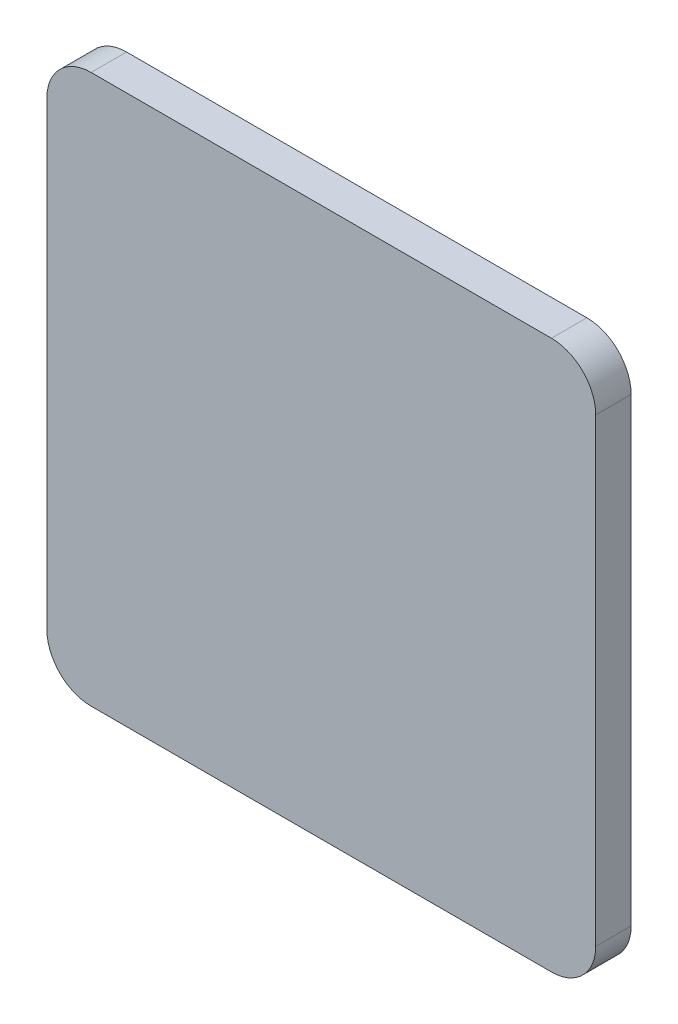
ISO-10303-21;
HEADER;
FILE_DESCRIPTION(('STEP AP214'),'2;1');
FILE_NAME('part.step','',(''),(''),'','','');
FILE_SCHEMA(('AUTOMOTIVE_DESIGN { 1 0 10303 214 1 1 1 1 }'));
ENDSEC;
DATA;
#1=APPLICATION_CONTEXT('core data for automotive mechanical design processes');
#2=APPLICATION_PROTOCOL_DEFINITION('international standard','automotive_design',2000,#1);
#3=PRODUCT_CONTEXT('',#1,'mechanical');
#4=PRODUCT('Part','Part','',(#3));
#5=PRODUCT_RELATED_PRODUCT_CATEGORY('part','',(#4));
#6=PRODUCT_DEFINITION_FORMATION('','',#4);
#7=PRODUCT_DEFINITION_CONTEXT('part definition',#1,'design');
#8=PRODUCT_DEFINITION('design','',#6,#7);
#9=PRODUCT_DEFINITION_SHAPE('','',#8);
#10=(LENGTH_UNIT() NAMED_UNIT(*) SI_UNIT(.MILLI.,.METRE.));
#11=(NAMED_UNIT(*) PLANE_ANGLE_UNIT() SI_UNIT($,.RADIAN.));
#12=(NAMED_UNIT(*) SI_UNIT($,.STERADIAN.) SOLID_ANGLE_UNIT());
#13=UNCERTAINTY_MEASURE_WITH_UNIT(LENGTH_MEASURE(1.E-05),#10,'distance_accuracy_value','');
#14=(GEOMETRIC_REPRESENTATION_CONTEXT(3) GLOBAL_UNCERTAINTY_ASSIGNED_CONTEXT((#13)) GLOBAL_UNIT_ASSIGNED_CONTEXT((#10,
#11,#12)) REPRESENTATION_CONTEXT('',''));
#15=CARTESIAN_POINT('',(0.,0.,0.));
#16=DIRECTION('',(0.,0.,1.));
#17=DIRECTION('',(1.,0.,0.));
#18=AXIS2_PLACEMENT_3D('',#15,#16,#17);
#19=CARTESIAN_POINT('',(-63.208571836183,-32.7973667305141,2.));
#20=DIRECTION('',(0.,0.,-1.));
#21=DIRECTION('',(-1.,0.,0.));
#22=AXIS2_PLACEMENT_3D('',#19,#20,#21);
#23=CYLINDRICAL_SURFACE('',#22,2.5);
#24=CARTESIAN_POINT('',(-63.208571836183,-32.7973667305141,0.));
#25=DIRECTION('',(0.,0.,1.));
#26=DIRECTION('',(1.,0.,0.));
#27=AXIS2_PLACEMENT_3D('',#24,#25,#26);
#28=CIRCLE('',#27,2.5);
#29=CARTESIAN_POINT('',(-65.708571836183,-32.7973667305141,0.));
#30=VERTEX_POINT('',#29);
#31=CARTESIAN_POINT('',(-63.208571836183,-35.2973667305141,0.));
#32=VERTEX_POINT('',#31);
#33=EDGE_CURVE('E129',#30,#32,#28,.T.);
#34=ORIENTED_EDGE('',*,*,#33,.T.);
#35=DIRECTION('',(0.,0.,-1.));
#36=VECTOR('',#35,1.);
#37=CARTESIAN_POINT('',(-63.208571836183,-35.2973667305141,2.));
#38=LINE('',#37,#36);
#39=CARTESIAN_POINT('',(-63.208571836183,-35.2973667305141,2.));
#40=VERTEX_POINT('',#39);
#41=EDGE_CURVE('E11',#40,#32,#38,.T.);
#42=ORIENTED_EDGE('',*,*,#41,.F.);
#43=CARTESIAN_POINT('',(-63.208571836183,-32.7973667305141,2.));
#44=DIRECTION('',(0.,0.,1.));
#45=DIRECTION('',(1.,0.,0.));
#46=AXIS2_PLACEMENT_3D('',#43,#44,#45);
#47=CIRCLE('',#46,2.5);
#48=CARTESIAN_POINT('',(-65.708571836183,-32.7973667305141,2.));
#49=VERTEX_POINT('',#48);
#50=EDGE_CURVE('E143',#49,#40,#47,.T.);
#51=ORIENTED_EDGE('',*,*,#50,.F.);
#52=DIRECTION('',(0.,0.,-1.));
#53=VECTOR('',#52,1.);
#54=CARTESIAN_POINT('',(-65.708571836183,-32.7973667305141,2.));
#55=LINE('',#54,#53);
#56=EDGE_CURVE('E125',#49,#30,#55,.T.);
#57=ORIENTED_EDGE('',*,*,#56,.T.);
#58=EDGE_LOOP('',(#34,#42,#51,#57));
#59=FACE_BOUND('',#58,.T.);
#60=ADVANCED_FACE('F33',(#59),#23,.T.);
#61=CARTESIAN_POINT('',(-37.208571836183,-35.2973667305141,2.));
#62=DIRECTION('',(0.,1.,0.));
#63=DIRECTION('',(0.,0.,1.));
#64=AXIS2_PLACEMENT_3D('',#61,#62,#63);
#65=PLANE('',#64);
#66=DIRECTION('',(1.,0.,0.));
#67=VECTOR('',#66,1.);
#68=CARTESIAN_POINT('',(-37.208571836183,-35.2973667305141,0.));
#69=LINE('',#68,#67);
#70=CARTESIAN_POINT('',(-37.208571836183,-35.2973667305141,0.));
#71=VERTEX_POINT('',#70);
#72=EDGE_CURVE('E132',#32,#71,#69,.T.);
#73=ORIENTED_EDGE('',*,*,#72,.T.);
#74=DIRECTION('',(0.,0.,-1.));
#75=VECTOR('',#74,1.);
#76=CARTESIAN_POINT('',(-37.208571836183,-35.2973667305141,2.));
#77=LINE('',#76,#75);
#78=CARTESIAN_POINT('',(-37.208571836183,-35.2973667305141,2.));
#79=VERTEX_POINT('',#78);
#80=EDGE_CURVE('E41',#79,#71,#77,.T.);
#81=ORIENTED_EDGE('',*,*,#80,.F.);
#82=DIRECTION('',(1.,0.,0.));
#83=VECTOR('',#82,1.);
#84=CARTESIAN_POINT('',(-37.208571836183,-35.2973667305141,2.));
#85=LINE('',#84,#83);
#86=EDGE_CURVE('E92',#40,#79,#85,.T.);
#87=ORIENTED_EDGE('',*,*,#86,.F.);
#88=ORIENTED_EDGE('',*,*,#41,.T.);
#89=EDGE_LOOP('',(#73,#81,#87,#88));
#90=FACE_BOUND('',#89,.T.);
#91=ADVANCED_FACE('F178',(#90),#65,.F.);
#92=CARTESIAN_POINT('',(-37.208571836183,-32.7973667305141,2.));
#93=DIRECTION('',(0.,0.,-1.));
#94=DIRECTION('',(-1.,0.,0.));
#95=AXIS2_PLACEMENT_3D('',#92,#93,#94);
#96=CYLINDRICAL_SURFACE('',#95,2.5);
#97=CARTESIAN_POINT('',(-37.208571836183,-32.7973667305141,0.));
#98=DIRECTION('',(0.,0.,1.));
#99=DIRECTION('',(1.,0.,0.));
#100=AXIS2_PLACEMENT_3D('',#97,#98,#99);
#101=CIRCLE('',#100,2.5);
#102=CARTESIAN_POINT('',(-34.7085718361831,-32.7973667305141,0.));
#103=VERTEX_POINT('',#102);
#104=EDGE_CURVE('E134',#71,#103,#101,.T.);
#105=ORIENTED_EDGE('',*,*,#104,.T.);
#106=DIRECTION('',(0.,0.,-1.));
#107=VECTOR('',#106,1.);
#108=CARTESIAN_POINT('',(-34.7085718361831,-32.7973667305141,2.));
#109=LINE('',#108,#107);
#110=CARTESIAN_POINT('',(-34.7085718361831,-32.7973667305141,2.));
#111=VERTEX_POINT('',#110);
#112=EDGE_CURVE('E150',#111,#103,#109,.T.);
#113=ORIENTED_EDGE('',*,*,#112,.F.);
#114=CARTESIAN_POINT('',(-37.208571836183,-32.7973667305141,2.));
#115=DIRECTION('',(0.,0.,1.));
#116=DIRECTION('',(1.,0.,0.));
#117=AXIS2_PLACEMENT_3D('',#114,#115,#116);
#118=CIRCLE('',#117,2.5);
#119=EDGE_CURVE('E158',#79,#111,#118,.T.);
#120=ORIENTED_EDGE('',*,*,#119,.F.);
#121=ORIENTED_EDGE('',*,*,#80,.T.);
#122=EDGE_LOOP('',(#105,#113,#120,#121));
#123=FACE_BOUND('',#122,.T.);
#124=ADVANCED_FACE('F156',(#123),#96,.T.);
#125=CARTESIAN_POINT('',(-34.708571836183,-6.79736673051408,2.));
#126=DIRECTION('',(-1.,0.,0.));
#127=DIRECTION('',(0.,-1.,0.));
#128=AXIS2_PLACEMENT_3D('',#125,#126,#127);
#129=PLANE('',#128);
#130=DIRECTION('',(0.,1.,0.));
#131=VECTOR('',#130,1.);
#132=CARTESIAN_POINT('',(-34.708571836183,-6.79736673051408,0.));
#133=LINE('',#132,#131);
#134=CARTESIAN_POINT('',(-34.708571836183,-6.79736673051408,0.));
#135=VERTEX_POINT('',#134);
#136=EDGE_CURVE('E136',#103,#135,#133,.T.);
#137=ORIENTED_EDGE('',*,*,#136,.T.);
#138=DIRECTION('',(0.,0.,-1.));
#139=VECTOR('',#138,1.);
#140=CARTESIAN_POINT('',(-34.708571836183,-6.79736673051408,2.));
#141=LINE('',#140,#139);
#142=CARTESIAN_POINT('',(-34.708571836183,-6.79736673051408,2.));
#143=VERTEX_POINT('',#142);
#144=EDGE_CURVE('E147',#143,#135,#141,.T.);
#145=ORIENTED_EDGE('',*,*,#144,.F.);
#146=DIRECTION('',(0.,1.,0.));
#147=VECTOR('',#146,1.);
#148=CARTESIAN_POINT('',(-34.708571836183,-6.79736673051408,2.));
#149=LINE('',#148,#147);
#150=EDGE_CURVE('E170',#111,#143,#149,.T.);
#151=ORIENTED_EDGE('',*,*,#150,.F.);
#152=ORIENTED_EDGE('',*,*,#112,.T.);
#153=EDGE_LOOP('',(#137,#145,#151,#152));
#154=FACE_BOUND('',#153,.T.);
#155=ADVANCED_FACE('F166',(#154),#129,.F.);
#156=CARTESIAN_POINT('',(-37.208571836183,-6.79736673051408,2.));
#157=DIRECTION('',(0.,0.,-1.));
#158=DIRECTION('',(-1.,0.,0.));
#159=AXIS2_PLACEMENT_3D('',#156,#157,#158);
#160=CYLINDRICAL_SURFACE('',#159,2.5);
#161=CARTESIAN_POINT('',(-37.208571836183,-6.79736673051408,0.));
#162=DIRECTION('',(0.,0.,1.));
#163=DIRECTION('',(1.,0.,0.));
#164=AXIS2_PLACEMENT_3D('',#161,#162,#163);
#165=CIRCLE('',#164,2.5);
#166=CARTESIAN_POINT('',(-37.208571836183,-4.29736673051408,0.));
#167=VERTEX_POINT('',#166);
#168=EDGE_CURVE('E138',#135,#167,#165,.T.);
#169=ORIENTED_EDGE('',*,*,#168,.T.);
#170=DIRECTION('',(0.,0.,-1.));
#171=VECTOR('',#170,1.);
#172=CARTESIAN_POINT('',(-37.208571836183,-4.29736673051408,2.));
#173=LINE('',#172,#171);
#174=CARTESIAN_POINT('',(-37.208571836183,-4.29736673051408,2.));
#175=VERTEX_POINT('',#174);
#176=EDGE_CURVE('E120',#175,#167,#173,.T.);
#177=ORIENTED_EDGE('',*,*,#176,.F.);
#178=CARTESIAN_POINT('',(-37.208571836183,-6.79736673051408,2.));
#179=DIRECTION('',(0.,0.,1.));
#180=DIRECTION('',(1.,0.,0.));
#181=AXIS2_PLACEMENT_3D('',#178,#179,#180);
#182=CIRCLE('',#181,2.5);
#183=EDGE_CURVE('E111',#143,#175,#182,.T.);
#184=ORIENTED_EDGE('',*,*,#183,.F.);
#185=ORIENTED_EDGE('',*,*,#144,.T.);
#186=EDGE_LOOP('',(#169,#177,#184,#185));
#187=FACE_BOUND('',#186,.T.);
#188=ADVANCED_FACE('F169',(#187),#160,.T.);
#189=CARTESIAN_POINT('',(-63.208571836183,-4.29736673051408,2.));
#190=DIRECTION('',(0.,-1.,0.));
#191=DIRECTION('',(0.,0.,-1.));
#192=AXIS2_PLACEMENT_3D('',#189,#190,#191);
#193=PLANE('',#192);
#194=DIRECTION('',(-1.,0.,0.));
#195=VECTOR('',#194,1.);
#196=CARTESIAN_POINT('',(-63.208571836183,-4.29736673051408,0.));
#197=LINE('',#196,#195);
#198=CARTESIAN_POINT('',(-63.208571836183,-4.29736673051408,0.));
#199=VERTEX_POINT('',#198);
#200=EDGE_CURVE('E119',#167,#199,#197,.T.);
#201=ORIENTED_EDGE('',*,*,#200,.T.);
#202=DIRECTION('',(0.,0.,-1.));
#203=VECTOR('',#202,1.);
#204=CARTESIAN_POINT('',(-63.208571836183,-4.29736673051408,2.));
#205=LINE('',#204,#203);
#206=CARTESIAN_POINT('',(-63.208571836183,-4.29736673051408,2.));
#207=VERTEX_POINT('',#206);
#208=EDGE_CURVE('E116',#207,#199,#205,.T.);
#209=ORIENTED_EDGE('',*,*,#208,.F.);
#210=DIRECTION('',(-1.,0.,0.));
#211=VECTOR('',#210,1.);
#212=CARTESIAN_POINT('',(-63.208571836183,-4.29736673051408,2.));
#213=LINE('',#212,#211);
#214=EDGE_CURVE('E105',#175,#207,#213,.T.);
#215=ORIENTED_EDGE('',*,*,#214,.F.);
#216=ORIENTED_EDGE('',*,*,#176,.T.);
#217=EDGE_LOOP('',(#201,#209,#215,#216));
#218=FACE_BOUND('',#217,.T.);
#219=ADVANCED_FACE('F117',(#218),#193,.F.);
#220=CARTESIAN_POINT('',(-63.208571836183,-6.79736673051408,2.));
#221=DIRECTION('',(0.,0.,-1.));
#222=DIRECTION('',(-1.,0.,0.));
#223=AXIS2_PLACEMENT_3D('',#220,#221,#222);
#224=CYLINDRICAL_SURFACE('',#223,2.5);
#225=CARTESIAN_POINT('',(-63.208571836183,-6.79736673051408,0.));
#226=DIRECTION('',(0.,0.,1.));
#227=DIRECTION('',(1.,0.,0.));
#228=AXIS2_PLACEMENT_3D('',#225,#226,#227);
#229=CIRCLE('',#228,2.5);
#230=CARTESIAN_POINT('',(-65.708571836183,-6.79736673051408,0.));
#231=VERTEX_POINT('',#230);
#232=EDGE_CURVE('E78',#199,#231,#229,.T.);
#233=ORIENTED_EDGE('',*,*,#232,.T.);
#234=DIRECTION('',(0.,0.,-1.));
#235=VECTOR('',#234,1.);
#236=CARTESIAN_POINT('',(-65.708571836183,-6.79736673051408,2.));
#237=LINE('',#236,#235);
#238=CARTESIAN_POINT('',(-65.708571836183,-6.79736673051408,2.));
#239=VERTEX_POINT('',#238);
#240=EDGE_CURVE('E121',#239,#231,#237,.T.);
#241=ORIENTED_EDGE('',*,*,#240,.F.);
#242=CARTESIAN_POINT('',(-63.208571836183,-6.79736673051408,2.));
#243=DIRECTION('',(0.,0.,1.));
#244=DIRECTION('',(1.,0.,0.));
#245=AXIS2_PLACEMENT_3D('',#242,#243,#244);
#246=CIRCLE('',#245,2.5);
#247=EDGE_CURVE('E109',#207,#239,#246,.T.);
#248=ORIENTED_EDGE('',*,*,#247,.F.);
#249=ORIENTED_EDGE('',*,*,#208,.T.);
#250=EDGE_LOOP('',(#233,#241,#248,#249));
#251=FACE_BOUND('',#250,.T.);
#252=ADVANCED_FACE('F123',(#251),#224,.T.);
#253=CARTESIAN_POINT('',(-65.708571836183,-32.7973667305141,2.));
#254=DIRECTION('',(1.,0.,0.));
#255=DIRECTION('',(0.,0.,-1.));
#256=AXIS2_PLACEMENT_3D('',#253,#254,#255);
#257=PLANE('',#256);
#258=DIRECTION('',(0.,-1.,0.));
#259=VECTOR('',#258,1.);
#260=CARTESIAN_POINT('',(-65.708571836183,-32.7973667305141,0.));
#261=LINE('',#260,#259);
#262=EDGE_CURVE('E84',#231,#30,#261,.T.);
#263=ORIENTED_EDGE('',*,*,#262,.T.);
#264=ORIENTED_EDGE('',*,*,#56,.F.);
#265=DIRECTION('',(0.,-1.,0.));
#266=VECTOR('',#265,1.);
#267=CARTESIAN_POINT('',(-65.708571836183,-32.7973667305141,2.));
#268=LINE('',#267,#266);
#269=EDGE_CURVE('E49',#239,#49,#268,.T.);
#270=ORIENTED_EDGE('',*,*,#269,.F.);
#271=ORIENTED_EDGE('',*,*,#240,.T.);
#272=EDGE_LOOP('',(#263,#264,#270,#271));
#273=FACE_BOUND('',#272,.T.);
#274=ADVANCED_FACE('F194',(#273),#257,.F.);
#275=CARTESIAN_POINT('',(-63.208571836183,-32.7973667305141,2.));
#276=DIRECTION('',(0.,0.,1.));
#277=DIRECTION('',(1.,0.,0.));
#278=AXIS2_PLACEMENT_3D('',#275,#276,#277);
#279=PLANE('',#278);
#280=ORIENTED_EDGE('',*,*,#50,.T.);
#281=ORIENTED_EDGE('',*,*,#86,.T.);
#282=ORIENTED_EDGE('',*,*,#119,.T.);
#283=ORIENTED_EDGE('',*,*,#150,.T.);
#284=ORIENTED_EDGE('',*,*,#183,.T.);
#285=ORIENTED_EDGE('',*,*,#214,.T.);
#286=ORIENTED_EDGE('',*,*,#247,.T.);
#287=ORIENTED_EDGE('',*,*,#269,.T.);
#288=EDGE_LOOP('',(#280,#281,#282,#283,#284,#285,#286,#287));
#289=FACE_BOUND('',#288,.T.);
#290=ADVANCED_FACE('F107',(#289),#279,.T.);
#291=CARTESIAN_POINT('',(-63.208571836183,-32.7973667305141,0.));
#292=DIRECTION('',(0.,0.,1.));
#293=DIRECTION('',(1.,0.,0.));
#294=AXIS2_PLACEMENT_3D('',#291,#292,#293);
#295=PLANE('',#294);
#296=ORIENTED_EDGE('',*,*,#33,.F.);
#297=ORIENTED_EDGE('',*,*,#262,.F.);
#298=ORIENTED_EDGE('',*,*,#232,.F.);
#299=ORIENTED_EDGE('',*,*,#200,.F.);
#300=ORIENTED_EDGE('',*,*,#168,.F.);
#301=ORIENTED_EDGE('',*,*,#136,.F.);
#302=ORIENTED_EDGE('',*,*,#104,.F.);
#303=ORIENTED_EDGE('',*,*,#72,.F.);
#304=EDGE_LOOP('',(#296,#297,#298,#299,#300,#301,#302,#303));
#305=FACE_BOUND('',#304,.T.);
#306=ADVANCED_FACE('F162',(#305),#295,.F.);
#307=CLOSED_SHELL('',(#60,#91,#124,#155,#188,#219,#252,#274,#290,#306));
#308=MANIFOLD_SOLID_BREP('B2',#307);
#309=ADVANCED_BREP_SHAPE_REPRESENTATION('',(#18,#308),#14);
#310=SHAPE_DEFINITION_REPRESENTATION(#9,#309);
ENDSEC;
END-ISO-10303-21;
